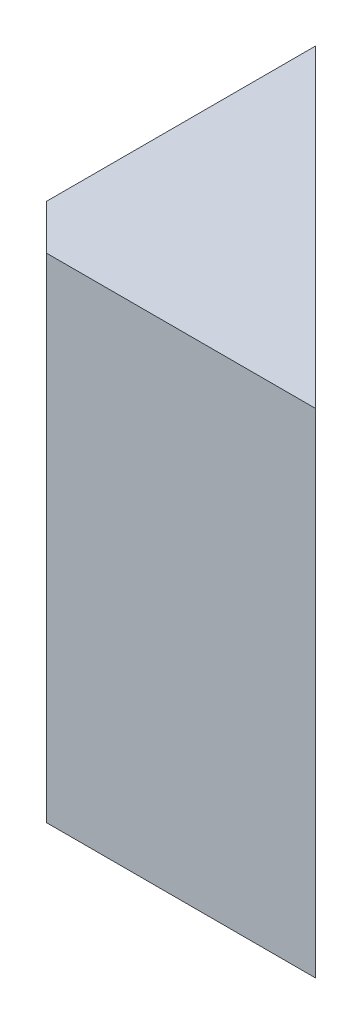
ISO-10303-21;
HEADER;
FILE_DESCRIPTION(('STEP AP214'),'2;1');
FILE_NAME('part.step','',(''),(''),'','','');
FILE_SCHEMA(('AUTOMOTIVE_DESIGN { 1 0 10303 214 1 1 1 1 }'));
ENDSEC;
DATA;
#1=APPLICATION_CONTEXT('core data for automotive mechanical design processes');
#2=APPLICATION_PROTOCOL_DEFINITION('international standard','automotive_design',2000,#1);
#3=PRODUCT_CONTEXT('',#1,'mechanical');
#4=PRODUCT('Part','Part','',(#3));
#5=PRODUCT_RELATED_PRODUCT_CATEGORY('part','',(#4));
#6=PRODUCT_DEFINITION_FORMATION('','',#4);
#7=PRODUCT_DEFINITION_CONTEXT('part definition',#1,'design');
#8=PRODUCT_DEFINITION('design','',#6,#7);
#9=PRODUCT_DEFINITION_SHAPE('','',#8);
#10=(LENGTH_UNIT() NAMED_UNIT(*) SI_UNIT(.MILLI.,.METRE.));
#11=(NAMED_UNIT(*) PLANE_ANGLE_UNIT() SI_UNIT($,.RADIAN.));
#12=(NAMED_UNIT(*) SI_UNIT($,.STERADIAN.) SOLID_ANGLE_UNIT());
#13=UNCERTAINTY_MEASURE_WITH_UNIT(LENGTH_MEASURE(1.E-05),#10,'distance_accuracy_value','');
#14=(GEOMETRIC_REPRESENTATION_CONTEXT(3) GLOBAL_UNCERTAINTY_ASSIGNED_CONTEXT((#13)) GLOBAL_UNIT_ASSIGNED_CONTEXT((#10,
#11,#12)) REPRESENTATION_CONTEXT('',''));
#15=CARTESIAN_POINT('',(0.,0.,0.));
#16=DIRECTION('',(0.,0.,1.));
#17=DIRECTION('',(1.,0.,0.));
#18=AXIS2_PLACEMENT_3D('',#15,#16,#17);
#19=CARTESIAN_POINT('',(0.,0.55,0.));
#20=DIRECTION('',(0.707106781186548,0.,-0.707106781186547));
#21=DIRECTION('',(-0.707106781186547,0.,-0.707106781186548));
#22=AXIS2_PLACEMENT_3D('',#19,#20,#21);
#23=PLANE('',#22);
#24=DIRECTION('',(0.707106781186547,0.,0.707106781186548));
#25=VECTOR('',#24,1.);
#26=CARTESIAN_POINT('',(0.,0.,0.));
#27=LINE('',#26,#25);
#28=CARTESIAN_POINT('',(0.,0.,0.));
#29=VERTEX_POINT('',#28);
#30=CARTESIAN_POINT('',(0.0499999999999994,0.,0.0499999999999995));
#31=VERTEX_POINT('',#30);
#32=EDGE_CURVE('E98',#29,#31,#27,.T.);
#33=ORIENTED_EDGE('',*,*,#32,.T.);
#34=DIRECTION('',(0.,-1.,0.));
#35=VECTOR('',#34,1.);
#36=CARTESIAN_POINT('',(0.0499999999999994,0.55,0.0499999999999995));
#37=LINE('',#36,#35);
#38=CARTESIAN_POINT('',(0.0499999999999994,0.55,0.0499999999999995));
#39=VERTEX_POINT('',#38);
#40=EDGE_CURVE('E11',#39,#31,#37,.T.);
#41=ORIENTED_EDGE('',*,*,#40,.F.);
#42=DIRECTION('',(0.707106781186547,0.,0.707106781186548));
#43=VECTOR('',#42,1.);
#44=CARTESIAN_POINT('',(0.,0.55,0.));
#45=LINE('',#44,#43);
#46=CARTESIAN_POINT('',(0.,0.55,0.));
#47=VERTEX_POINT('',#46);
#48=EDGE_CURVE('E86',#47,#39,#45,.T.);
#49=ORIENTED_EDGE('',*,*,#48,.F.);
#50=DIRECTION('',(0.,-1.,0.));
#51=VECTOR('',#50,1.);
#52=CARTESIAN_POINT('',(0.,0.55,0.));
#53=LINE('',#52,#51);
#54=EDGE_CURVE('E94',#47,#29,#53,.T.);
#55=ORIENTED_EDGE('',*,*,#54,.T.);
#56=EDGE_LOOP('',(#33,#41,#49,#55));
#57=FACE_BOUND('',#56,.T.);
#58=ADVANCED_FACE('F35',(#57),#23,.F.);
#59=CARTESIAN_POINT('',(0.0499999999999994,0.55,0.0499999999999995));
#60=DIRECTION('',(0.,0.,-1.));
#61=DIRECTION('',(-1.,0.,0.));
#62=AXIS2_PLACEMENT_3D('',#59,#60,#61);
#63=PLANE('',#62);
#64=DIRECTION('',(1.,0.,0.));
#65=VECTOR('',#64,1.);
#66=CARTESIAN_POINT('',(0.0499999999999994,0.,0.0499999999999995));
#67=LINE('',#66,#65);
#68=CARTESIAN_POINT('',(0.349999999999999,0.,0.0500000000000005));
#69=VERTEX_POINT('',#68);
#70=EDGE_CURVE('E90',#31,#69,#67,.T.);
#71=ORIENTED_EDGE('',*,*,#70,.T.);
#72=DIRECTION('',(0.,-1.,0.));
#73=VECTOR('',#72,1.);
#74=CARTESIAN_POINT('',(0.349999999999999,0.55,0.0500000000000005));
#75=LINE('',#74,#73);
#76=CARTESIAN_POINT('',(0.349999999999999,0.55,0.0500000000000005));
#77=VERTEX_POINT('',#76);
#78=EDGE_CURVE('E43',#77,#69,#75,.T.);
#79=ORIENTED_EDGE('',*,*,#78,.F.);
#80=DIRECTION('',(1.,0.,0.));
#81=VECTOR('',#80,1.);
#82=CARTESIAN_POINT('',(0.0499999999999994,0.55,0.0499999999999995));
#83=LINE('',#82,#81);
#84=EDGE_CURVE('E81',#39,#77,#83,.T.);
#85=ORIENTED_EDGE('',*,*,#84,.F.);
#86=ORIENTED_EDGE('',*,*,#40,.T.);
#87=EDGE_LOOP('',(#71,#79,#85,#86));
#88=FACE_BOUND('',#87,.T.);
#89=ADVANCED_FACE('F89',(#88),#63,.F.);
#90=CARTESIAN_POINT('',(0.,0.55,-0.3));
#91=DIRECTION('',(-0.707106781186549,0.,0.707106781186547));
#92=DIRECTION('',(0.707106781186547,0.,0.707106781186549));
#93=AXIS2_PLACEMENT_3D('',#90,#91,#92);
#94=PLANE('',#93);
#95=DIRECTION('',(-0.707106781186546,0.,-0.707106781186548));
#96=VECTOR('',#95,1.);
#97=CARTESIAN_POINT('',(0.,0.,-0.3));
#98=LINE('',#97,#96);
#99=CARTESIAN_POINT('',(0.,0.,-0.3));
#100=VERTEX_POINT('',#99);
#101=EDGE_CURVE('E68',#69,#100,#98,.T.);
#102=ORIENTED_EDGE('',*,*,#101,.T.);
#103=DIRECTION('',(0.,-1.,0.));
#104=VECTOR('',#103,1.);
#105=CARTESIAN_POINT('',(0.,0.55,-0.3));
#106=LINE('',#105,#104);
#107=CARTESIAN_POINT('',(0.,0.55,-0.3));
#108=VERTEX_POINT('',#107);
#109=EDGE_CURVE('E91',#108,#100,#106,.T.);
#110=ORIENTED_EDGE('',*,*,#109,.F.);
#111=DIRECTION('',(-0.707106781186546,0.,-0.707106781186548));
#112=VECTOR('',#111,1.);
#113=CARTESIAN_POINT('',(0.,0.55,-0.3));
#114=LINE('',#113,#112);
#115=EDGE_CURVE('E84',#77,#108,#114,.T.);
#116=ORIENTED_EDGE('',*,*,#115,.F.);
#117=ORIENTED_EDGE('',*,*,#78,.T.);
#118=EDGE_LOOP('',(#102,#110,#116,#117));
#119=FACE_BOUND('',#118,.T.);
#120=ADVANCED_FACE('F92',(#119),#94,.F.);
#121=CARTESIAN_POINT('',(0.,0.55,0.));
#122=DIRECTION('',(1.,0.,0.));
#123=DIRECTION('',(0.,0.,-1.));
#124=AXIS2_PLACEMENT_3D('',#121,#122,#123);
#125=PLANE('',#124);
#126=DIRECTION('',(0.,0.,1.));
#127=VECTOR('',#126,1.);
#128=CARTESIAN_POINT('',(0.,0.,0.));
#129=LINE('',#128,#127);
#130=EDGE_CURVE('E74',#100,#29,#129,.T.);
#131=ORIENTED_EDGE('',*,*,#130,.T.);
#132=ORIENTED_EDGE('',*,*,#54,.F.);
#133=DIRECTION('',(0.,0.,1.));
#134=VECTOR('',#133,1.);
#135=CARTESIAN_POINT('',(0.,0.55,0.));
#136=LINE('',#135,#134);
#137=EDGE_CURVE('E51',#108,#47,#136,.T.);
#138=ORIENTED_EDGE('',*,*,#137,.F.);
#139=ORIENTED_EDGE('',*,*,#109,.T.);
#140=EDGE_LOOP('',(#131,#132,#138,#139));
#141=FACE_BOUND('',#140,.T.);
#142=ADVANCED_FACE('F105',(#141),#125,.F.);
#143=CARTESIAN_POINT('',(0.,0.55,0.));
#144=DIRECTION('',(0.,1.,0.));
#145=DIRECTION('',(0.,0.,1.));
#146=AXIS2_PLACEMENT_3D('',#143,#144,#145);
#147=PLANE('',#146);
#148=ORIENTED_EDGE('',*,*,#48,.T.);
#149=ORIENTED_EDGE('',*,*,#84,.T.);
#150=ORIENTED_EDGE('',*,*,#115,.T.);
#151=ORIENTED_EDGE('',*,*,#137,.T.);
#152=EDGE_LOOP('',(#148,#149,#150,#151));
#153=FACE_BOUND('',#152,.T.);
#154=ADVANCED_FACE('F82',(#153),#147,.T.);
#155=CARTESIAN_POINT('',(0.,0.,0.));
#156=DIRECTION('',(0.,1.,0.));
#157=DIRECTION('',(0.,0.,1.));
#158=AXIS2_PLACEMENT_3D('',#155,#156,#157);
#159=PLANE('',#158);
#160=ORIENTED_EDGE('',*,*,#32,.F.);
#161=ORIENTED_EDGE('',*,*,#130,.F.);
#162=ORIENTED_EDGE('',*,*,#101,.F.);
#163=ORIENTED_EDGE('',*,*,#70,.F.);
#164=EDGE_LOOP('',(#160,#161,#162,#163));
#165=FACE_BOUND('',#164,.T.);
#166=ADVANCED_FACE('F108',(#165),#159,.F.);
#167=CLOSED_SHELL('',(#58,#89,#120,#142,#154,#166));
#168=MANIFOLD_SOLID_BREP('B2',#167);
#169=ADVANCED_BREP_SHAPE_REPRESENTATION('',(#18,#168),#14);
#170=SHAPE_DEFINITION_REPRESENTATION(#9,#169);
ENDSEC;
END-ISO-10303-21;
